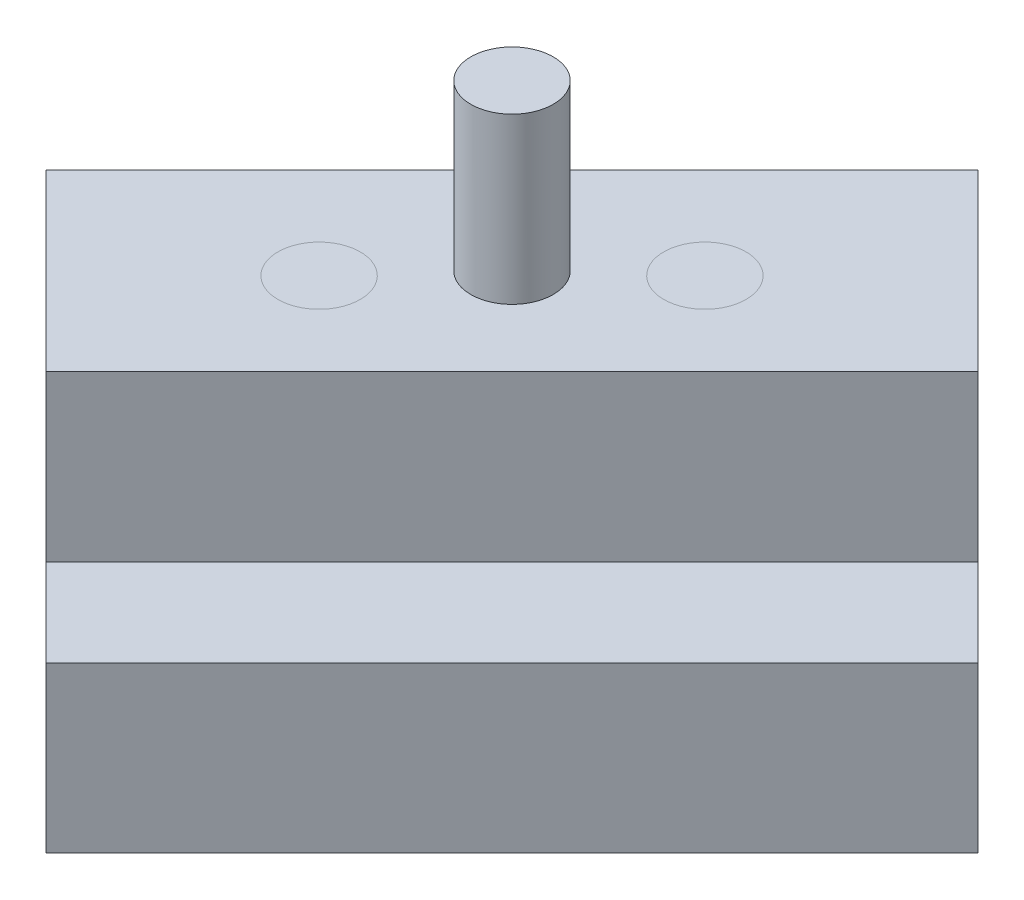
ISO-10303-21;
HEADER;
FILE_DESCRIPTION(('STEP AP214'),'2;1');
FILE_NAME('part.step','',(''),(''),'','','');
FILE_SCHEMA(('AUTOMOTIVE_DESIGN { 1 0 10303 214 1 1 1 1 }'));
ENDSEC;
DATA;
#1=APPLICATION_CONTEXT('core data for automotive mechanical design processes');
#2=APPLICATION_PROTOCOL_DEFINITION('international standard','automotive_design',2000,#1);
#3=PRODUCT_CONTEXT('',#1,'mechanical');
#4=PRODUCT('Part','Part','',(#3));
#5=PRODUCT_RELATED_PRODUCT_CATEGORY('part','',(#4));
#6=PRODUCT_DEFINITION_FORMATION('','',#4);
#7=PRODUCT_DEFINITION_CONTEXT('part definition',#1,'design');
#8=PRODUCT_DEFINITION('design','',#6,#7);
#9=PRODUCT_DEFINITION_SHAPE('','',#8);
#10=(LENGTH_UNIT() NAMED_UNIT(*) SI_UNIT(.MILLI.,.METRE.));
#11=(NAMED_UNIT(*) PLANE_ANGLE_UNIT() SI_UNIT($,.RADIAN.));
#12=(NAMED_UNIT(*) SI_UNIT($,.STERADIAN.) SOLID_ANGLE_UNIT());
#13=UNCERTAINTY_MEASURE_WITH_UNIT(LENGTH_MEASURE(1.E-05),#10,'distance_accuracy_value','');
#14=(GEOMETRIC_REPRESENTATION_CONTEXT(3) GLOBAL_UNCERTAINTY_ASSIGNED_CONTEXT((#13)) GLOBAL_UNIT_ASSIGNED_CONTEXT((#10,
#11,#12)) REPRESENTATION_CONTEXT('',''));
#15=CARTESIAN_POINT('',(0.,0.,0.));
#16=DIRECTION('',(0.,0.,1.));
#17=DIRECTION('',(1.,0.,0.));
#18=AXIS2_PLACEMENT_3D('',#15,#16,#17);
#19=CARTESIAN_POINT('',(-60.6167288172171,180.092101802552,-96.5377533014934));
#20=DIRECTION('',(0.,-1.,0.));
#21=DIRECTION('',(-0.707106781186549,0.,-0.707106781186546));
#22=AXIS2_PLACEMENT_3D('',#19,#20,#21);
#23=PLANE('',#22);
#24=CARTESIAN_POINT('',(-85.3124331501572,180.092101802552,-85.3124331501569));
#25=DIRECTION('',(0.,-1.,0.));
#26=DIRECTION('',(-0.707106781186549,0.,-0.707106781186546));
#27=AXIS2_PLACEMENT_3D('',#24,#25,#26);
#28=CIRCLE('',#27,3.175);
#29=CARTESIAN_POINT('',(-87.5574971804245,180.092101802552,-87.5574971804242));
#30=VERTEX_POINT('',#29);
#31=EDGE_CURVE('E11',#30,#30,#28,.F.);
#32=ORIENTED_EDGE('',*,*,#31,.F.);
#33=EDGE_LOOP('',(#32));
#34=FACE_BOUND('',#33,.T.);
#35=DIRECTION('',(0.707106781186549,0.,0.707106781186546));
#36=VECTOR('',#35,1.);
#37=CARTESIAN_POINT('',(-96.5377533014937,180.092101802552,-60.6167288172168));
#38=LINE('',#37,#36);
#39=CARTESIAN_POINT('',(-110.008137483097,180.092101802552,-74.0871129988205));
#40=VERTEX_POINT('',#39);
#41=CARTESIAN_POINT('',(-96.5377533014937,180.092101802552,-60.6167288172168));
#42=VERTEX_POINT('',#41);
#43=EDGE_CURVE('E131',#40,#42,#38,.T.);
#44=ORIENTED_EDGE('',*,*,#43,.T.);
#45=DIRECTION('',(-0.707106781186546,0.,0.707106781186549));
#46=VECTOR('',#45,1.);
#47=CARTESIAN_POINT('',(-60.6167288172171,180.092101802552,-96.5377533014934));
#48=LINE('',#47,#46);
#49=CARTESIAN_POINT('',(-60.6167288172171,180.092101802552,-96.5377533014934));
#50=VERTEX_POINT('',#49);
#51=EDGE_CURVE('E128',#50,#42,#48,.T.);
#52=ORIENTED_EDGE('',*,*,#51,.F.);
#53=DIRECTION('',(0.707106781186549,0.,0.707106781186546));
#54=VECTOR('',#53,1.);
#55=CARTESIAN_POINT('',(-60.6167288172171,180.092101802552,-96.5377533014934));
#56=LINE('',#55,#54);
#57=CARTESIAN_POINT('',(-74.0871129988209,180.092101802552,-110.008137483097));
#58=VERTEX_POINT('',#57);
#59=EDGE_CURVE('E116',#58,#50,#56,.T.);
#60=ORIENTED_EDGE('',*,*,#59,.F.);
#61=DIRECTION('',(-0.707106781186546,0.,0.707106781186549));
#62=VECTOR('',#61,1.);
#63=CARTESIAN_POINT('',(-74.0871129988209,180.092101802552,-110.008137483097));
#64=LINE('',#63,#62);
#65=EDGE_CURVE('E133',#58,#40,#64,.T.);
#66=ORIENTED_EDGE('',*,*,#65,.T.);
#67=EDGE_LOOP('',(#44,#52,#60,#66));
#68=FACE_BOUND('',#67,.T.);
#69=CARTESIAN_POINT('',(-77.5523251086812,180.092101802552,-92.4232620623047));
#70=DIRECTION('',(0.,-1.,0.));
#71=DIRECTION('',(-0.707106781186549,0.,-0.707106781186546));
#72=AXIS2_PLACEMENT_3D('',#69,#70,#71);
#73=CIRCLE('',#72,3.175);
#74=CARTESIAN_POINT('',(-79.7973891389485,180.092101802552,-94.668326092572));
#75=VERTEX_POINT('',#74);
#76=EDGE_CURVE('E175',#75,#75,#73,.F.);
#77=ORIENTED_EDGE('',*,*,#76,.F.);
#78=EDGE_LOOP('',(#77));
#79=FACE_BOUND('',#78,.T.);
#80=CARTESIAN_POINT('',(-92.423262062305,180.092101802552,-77.5523251086809));
#81=DIRECTION('',(0.,-1.,0.));
#82=DIRECTION('',(-0.707106781186549,0.,-0.707106781186546));
#83=AXIS2_PLACEMENT_3D('',#80,#81,#82);
#84=CIRCLE('',#83,3.175);
#85=CARTESIAN_POINT('',(-94.6683260925723,180.092101802552,-79.7973891389482));
#86=VERTEX_POINT('',#85);
#87=EDGE_CURVE('E53',#86,#86,#84,.F.);
#88=ORIENTED_EDGE('',*,*,#87,.F.);
#89=EDGE_LOOP('',(#88));
#90=FACE_BOUND('',#89,.T.);
#91=ADVANCED_FACE('F43',(#34,#68,#79,#90),#23,.F.);
#92=ORIENTED_EDGE('',*,*,#87,.T.);
#93=EDGE_LOOP('',(#92));
#94=FACE_BOUND('',#93,.T.);
#95=ADVANCED_FACE('F183',(#94),#23,.F.);
#96=CARTESIAN_POINT('',(-53.8815367264129,154.692101802552,-89.8025612106893));
#97=DIRECTION('',(-0.707106781186549,0.,-0.707106781186546));
#98=DIRECTION('',(-0.707106781186546,0.,0.707106781186549));
#99=AXIS2_PLACEMENT_3D('',#96,#97,#98);
#100=PLANE('',#99);
#101=DIRECTION('',(0.,-1.,0.));
#102=VECTOR('',#101,1.);
#103=CARTESIAN_POINT('',(-89.8025612106895,154.692101802552,-53.8815367264126));
#104=LINE('',#103,#102);
#105=CARTESIAN_POINT('',(-89.8025612106895,167.392101802557,-53.8815367264126));
#106=VERTEX_POINT('',#105);
#107=CARTESIAN_POINT('',(-89.8025612106895,154.692101802552,-53.8815367264126));
#108=VERTEX_POINT('',#107);
#109=EDGE_CURVE('E145',#106,#108,#104,.T.);
#110=ORIENTED_EDGE('',*,*,#109,.T.);
#111=DIRECTION('',(-0.707106781186546,0.,0.707106781186549));
#112=VECTOR('',#111,1.);
#113=CARTESIAN_POINT('',(-53.8815367264129,154.692101802552,-89.8025612106893));
#114=LINE('',#113,#112);
#115=CARTESIAN_POINT('',(-53.8815367264129,154.692101802552,-89.8025612106893));
#116=VERTEX_POINT('',#115);
#117=EDGE_CURVE('E172',#116,#108,#114,.T.);
#118=ORIENTED_EDGE('',*,*,#117,.F.);
#119=DIRECTION('',(0.,-1.,0.));
#120=VECTOR('',#119,1.);
#121=CARTESIAN_POINT('',(-53.8815367264129,154.692101802552,-89.8025612106893));
#122=LINE('',#121,#120);
#123=CARTESIAN_POINT('',(-53.8815367264129,167.392101802557,-89.8025612106893));
#124=VERTEX_POINT('',#123);
#125=EDGE_CURVE('E162',#124,#116,#122,.T.);
#126=ORIENTED_EDGE('',*,*,#125,.F.);
#127=DIRECTION('',(-0.707106781186546,0.,0.707106781186549));
#128=VECTOR('',#127,1.);
#129=CARTESIAN_POINT('',(-53.8815367264129,167.392101802557,-89.8025612106893));
#130=LINE('',#129,#128);
#131=EDGE_CURVE('E141',#124,#106,#130,.T.);
#132=ORIENTED_EDGE('',*,*,#131,.T.);
#133=EDGE_LOOP('',(#110,#118,#126,#132));
#134=FACE_BOUND('',#133,.T.);
#135=ADVANCED_FACE('F45',(#134),#100,.F.);
#136=CARTESIAN_POINT('',(-74.0871129988208,154.692101802552,-110.008137483097));
#137=DIRECTION('',(0.,1.,0.));
#138=DIRECTION('',(0.707106781186549,0.,0.707106781186546));
#139=AXIS2_PLACEMENT_3D('',#136,#137,#138);
#140=PLANE('',#139);
#141=DIRECTION('',(-0.707106781186549,0.,-0.707106781186546));
#142=VECTOR('',#141,1.);
#143=CARTESIAN_POINT('',(-110.008137483097,154.692101802552,-74.0871129988205));
#144=LINE('',#143,#142);
#145=CARTESIAN_POINT('',(-110.008137483097,154.692101802552,-74.0871129988205));
#146=VERTEX_POINT('',#145);
#147=EDGE_CURVE('E149',#108,#146,#144,.T.);
#148=ORIENTED_EDGE('',*,*,#147,.T.);
#149=DIRECTION('',(-0.707106781186546,0.,0.707106781186549));
#150=VECTOR('',#149,1.);
#151=CARTESIAN_POINT('',(-74.0871129988208,154.692101802552,-110.008137483097));
#152=LINE('',#151,#150);
#153=CARTESIAN_POINT('',(-74.0871129988208,154.692101802552,-110.008137483097));
#154=VERTEX_POINT('',#153);
#155=EDGE_CURVE('E168',#154,#146,#152,.T.);
#156=ORIENTED_EDGE('',*,*,#155,.F.);
#157=DIRECTION('',(-0.707106781186549,0.,-0.707106781186546));
#158=VECTOR('',#157,1.);
#159=CARTESIAN_POINT('',(-74.0871129988208,154.692101802552,-110.008137483097));
#160=LINE('',#159,#158);
#161=EDGE_CURVE('E108',#116,#154,#160,.T.);
#162=ORIENTED_EDGE('',*,*,#161,.F.);
#163=ORIENTED_EDGE('',*,*,#117,.T.);
#164=EDGE_LOOP('',(#148,#156,#162,#163));
#165=FACE_BOUND('',#164,.T.);
#166=ADVANCED_FACE('F203',(#165),#140,.F.);
#167=CARTESIAN_POINT('',(-74.0871129988209,180.092101802552,-110.008137483097));
#168=DIRECTION('',(0.707106781186549,0.,0.707106781186546));
#169=DIRECTION('',(0.,-1.,0.));
#170=AXIS2_PLACEMENT_3D('',#167,#168,#169);
#171=PLANE('',#170);
#172=DIRECTION('',(0.,1.,0.));
#173=VECTOR('',#172,1.);
#174=CARTESIAN_POINT('',(-110.008137483097,180.092101802552,-74.0871129988205));
#175=LINE('',#174,#173);
#176=EDGE_CURVE('E153',#146,#40,#175,.T.);
#177=ORIENTED_EDGE('',*,*,#176,.T.);
#178=ORIENTED_EDGE('',*,*,#65,.F.);
#179=DIRECTION('',(0.,1.,0.));
#180=VECTOR('',#179,1.);
#181=CARTESIAN_POINT('',(-74.0871129988209,180.092101802552,-110.008137483097));
#182=LINE('',#181,#180);
#183=EDGE_CURVE('E122',#154,#58,#182,.T.);
#184=ORIENTED_EDGE('',*,*,#183,.F.);
#185=ORIENTED_EDGE('',*,*,#155,.T.);
#186=EDGE_LOOP('',(#177,#178,#184,#185));
#187=FACE_BOUND('',#186,.T.);
#188=ADVANCED_FACE('F196',(#187),#171,.F.);
#189=ORIENTED_EDGE('',*,*,#76,.T.);
#190=EDGE_LOOP('',(#189));
#191=FACE_BOUND('',#190,.T.);
#192=ADVANCED_FACE('F188',(#191),#23,.F.);
#193=CARTESIAN_POINT('',(-60.6167288172171,167.392101802552,-96.5377533014934));
#194=DIRECTION('',(-0.707106781186549,0.,-0.707106781186546));
#195=DIRECTION('',(-0.707106781186546,0.,0.707106781186549));
#196=AXIS2_PLACEMENT_3D('',#193,#194,#195);
#197=PLANE('',#196);
#198=DIRECTION('',(0.,-1.,0.));
#199=VECTOR('',#198,1.);
#200=CARTESIAN_POINT('',(-96.5377533014937,167.392101802552,-60.6167288172168));
#201=LINE('',#200,#199);
#202=CARTESIAN_POINT('',(-96.5377533014937,167.392101802552,-60.6167288172168));
#203=VERTEX_POINT('',#202);
#204=EDGE_CURVE('E92',#42,#203,#201,.T.);
#205=ORIENTED_EDGE('',*,*,#204,.T.);
#206=DIRECTION('',(-0.707106781186546,0.,0.707106781186549));
#207=VECTOR('',#206,1.);
#208=CARTESIAN_POINT('',(-60.6167288172171,167.392101802552,-96.5377533014934));
#209=LINE('',#208,#207);
#210=CARTESIAN_POINT('',(-60.6167288172171,167.392101802552,-96.5377533014934));
#211=VERTEX_POINT('',#210);
#212=EDGE_CURVE('E134',#211,#203,#209,.T.);
#213=ORIENTED_EDGE('',*,*,#212,.F.);
#214=DIRECTION('',(0.,-1.,0.));
#215=VECTOR('',#214,1.);
#216=CARTESIAN_POINT('',(-60.6167288172171,167.392101802552,-96.5377533014934));
#217=LINE('',#216,#215);
#218=EDGE_CURVE('E120',#50,#211,#217,.T.);
#219=ORIENTED_EDGE('',*,*,#218,.F.);
#220=ORIENTED_EDGE('',*,*,#51,.T.);
#221=EDGE_LOOP('',(#205,#213,#219,#220));
#222=FACE_BOUND('',#221,.T.);
#223=ADVANCED_FACE('F136',(#222),#197,.F.);
#224=CARTESIAN_POINT('',(-53.8815367264129,167.392101802557,-89.8025612106893));
#225=DIRECTION('',(3.70887982366121E-13,-1.,3.70887982366119E-13));
#226=DIRECTION('',(-0.707106781186549,-5.2451481478336E-13,-0.707106781186546));
#227=AXIS2_PLACEMENT_3D('',#224,#225,#226);
#228=PLANE('',#227);
#229=DIRECTION('',(0.707106781186549,5.2451481478336E-13,0.707106781186546));
#230=VECTOR('',#229,1.);
#231=CARTESIAN_POINT('',(-89.8025612106895,167.392101802557,-53.8815367264126));
#232=LINE('',#231,#230);
#233=EDGE_CURVE('E98',#203,#106,#232,.T.);
#234=ORIENTED_EDGE('',*,*,#233,.T.);
#235=ORIENTED_EDGE('',*,*,#131,.F.);
#236=DIRECTION('',(0.707106781186549,5.2451481478336E-13,0.707106781186546));
#237=VECTOR('',#236,1.);
#238=CARTESIAN_POINT('',(-53.8815367264129,167.392101802557,-89.8025612106893));
#239=LINE('',#238,#237);
#240=EDGE_CURVE('E63',#211,#124,#239,.T.);
#241=ORIENTED_EDGE('',*,*,#240,.F.);
#242=ORIENTED_EDGE('',*,*,#212,.T.);
#243=EDGE_LOOP('',(#234,#235,#241,#242));
#244=FACE_BOUND('',#243,.T.);
#245=ADVANCED_FACE('F202',(#244),#228,.F.);
#246=CARTESIAN_POINT('',(17.9605122421383,0.,-17.9605122421383));
#247=DIRECTION('',(-0.707106781186546,0.,0.707106781186549));
#248=DIRECTION('',(0.707106781186549,0.,0.707106781186546));
#249=AXIS2_PLACEMENT_3D('',#246,#247,#248);
#250=PLANE('',#249);
#251=ORIENTED_EDGE('',*,*,#125,.T.);
#252=ORIENTED_EDGE('',*,*,#161,.T.);
#253=ORIENTED_EDGE('',*,*,#183,.T.);
#254=ORIENTED_EDGE('',*,*,#59,.T.);
#255=ORIENTED_EDGE('',*,*,#218,.T.);
#256=ORIENTED_EDGE('',*,*,#240,.T.);
#257=EDGE_LOOP('',(#251,#252,#253,#254,#255,#256));
#258=FACE_BOUND('',#257,.T.);
#259=ADVANCED_FACE('F118',(#258),#250,.F.);
#260=CARTESIAN_POINT('',(-17.9605122421383,0.,17.9605122421383));
#261=DIRECTION('',(-0.707106781186546,0.,0.707106781186549));
#262=DIRECTION('',(0.707106781186549,0.,0.707106781186546));
#263=AXIS2_PLACEMENT_3D('',#260,#261,#262);
#264=PLANE('',#263);
#265=ORIENTED_EDGE('',*,*,#109,.F.);
#266=ORIENTED_EDGE('',*,*,#233,.F.);
#267=ORIENTED_EDGE('',*,*,#204,.F.);
#268=ORIENTED_EDGE('',*,*,#43,.F.);
#269=ORIENTED_EDGE('',*,*,#176,.F.);
#270=ORIENTED_EDGE('',*,*,#147,.F.);
#271=EDGE_LOOP('',(#265,#266,#267,#268,#269,#270));
#272=FACE_BOUND('',#271,.T.);
#273=ADVANCED_FACE('F212',(#272),#264,.T.);
#274=CARTESIAN_POINT('',(-85.3124331501572,192.792101802552,-85.3124331501569));
#275=DIRECTION('',(0.,-1.,0.));
#276=DIRECTION('',(-0.707106781186549,0.,-0.707106781186546));
#277=AXIS2_PLACEMENT_3D('',#274,#275,#276);
#278=CYLINDRICAL_SURFACE('',#277,3.175);
#279=CARTESIAN_POINT('',(-85.3124331501572,192.792101802552,-85.3124331501569));
#280=DIRECTION('',(0.,1.,0.));
#281=DIRECTION('',(0.707106781186549,0.,0.707106781186546));
#282=AXIS2_PLACEMENT_3D('',#279,#280,#281);
#283=CIRCLE('',#282,3.175);
#284=CARTESIAN_POINT('',(-83.0673691198899,192.792101802552,-83.0673691198896));
#285=VERTEX_POINT('',#284);
#286=EDGE_CURVE('E150',#285,#285,#283,.T.);
#287=ORIENTED_EDGE('',*,*,#286,.F.);
#288=EDGE_LOOP('',(#287));
#289=FACE_BOUND('',#288,.T.);
#290=ORIENTED_EDGE('',*,*,#31,.T.);
#291=EDGE_LOOP('',(#290));
#292=FACE_BOUND('',#291,.T.);
#293=ADVANCED_FACE('F224',(#289,#292),#278,.T.);
#294=CARTESIAN_POINT('',(-85.3124331501572,192.792101802552,-85.3124331501569));
#295=DIRECTION('',(0.,1.,0.));
#296=DIRECTION('',(0.707106781186549,0.,0.707106781186546));
#297=AXIS2_PLACEMENT_3D('',#294,#295,#296);
#298=PLANE('',#297);
#299=ORIENTED_EDGE('',*,*,#286,.T.);
#300=EDGE_LOOP('',(#299));
#301=FACE_BOUND('',#300,.T.);
#302=ADVANCED_FACE('F228',(#301),#298,.T.);
#303=CLOSED_SHELL('',(#91,#95,#135,#166,#188,#192,#223,#245,#259,#273,#293,#302));
#304=MANIFOLD_SOLID_BREP('B2',#303);
#305=ADVANCED_BREP_SHAPE_REPRESENTATION('',(#18,#304),#14);
#306=SHAPE_DEFINITION_REPRESENTATION(#9,#305);
ENDSEC;
END-ISO-10303-21;
